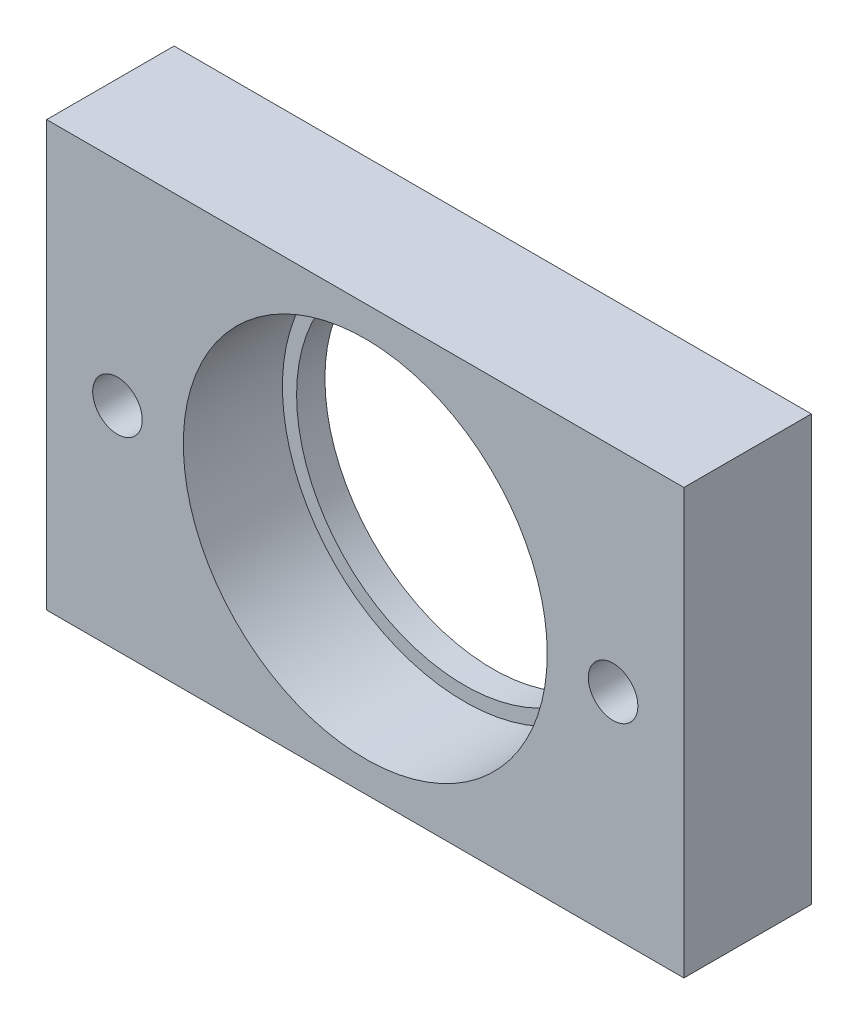
ISO-10303-21;
HEADER;
FILE_DESCRIPTION(('STEP AP214'),'2;1');
FILE_NAME('part.step','',(''),(''),'','','');
FILE_SCHEMA(('AUTOMOTIVE_DESIGN { 1 0 10303 214 1 1 1 1 }'));
ENDSEC;
DATA;
#1=APPLICATION_CONTEXT('core data for automotive mechanical design processes');
#2=APPLICATION_PROTOCOL_DEFINITION('international standard','automotive_design',2000,#1);
#3=PRODUCT_CONTEXT('',#1,'mechanical');
#4=PRODUCT('Part','Part','',(#3));
#5=PRODUCT_RELATED_PRODUCT_CATEGORY('part','',(#4));
#6=PRODUCT_DEFINITION_FORMATION('','',#4);
#7=PRODUCT_DEFINITION_CONTEXT('part definition',#1,'design');
#8=PRODUCT_DEFINITION('design','',#6,#7);
#9=PRODUCT_DEFINITION_SHAPE('','',#8);
#10=(LENGTH_UNIT() NAMED_UNIT(*) SI_UNIT(.MILLI.,.METRE.));
#11=(NAMED_UNIT(*) PLANE_ANGLE_UNIT() SI_UNIT($,.RADIAN.));
#12=(NAMED_UNIT(*) SI_UNIT($,.STERADIAN.) SOLID_ANGLE_UNIT());
#13=UNCERTAINTY_MEASURE_WITH_UNIT(LENGTH_MEASURE(1.E-05),#10,'distance_accuracy_value','');
#14=(GEOMETRIC_REPRESENTATION_CONTEXT(3) GLOBAL_UNCERTAINTY_ASSIGNED_CONTEXT((#13)) GLOBAL_UNIT_ASSIGNED_CONTEXT((#10,
#11,#12)) REPRESENTATION_CONTEXT('',''));
#15=CARTESIAN_POINT('',(0.,0.,0.));
#16=DIRECTION('',(0.,0.,1.));
#17=DIRECTION('',(1.,0.,0.));
#18=AXIS2_PLACEMENT_3D('',#15,#16,#17);
#19=CARTESIAN_POINT('',(0.,0.,9.));
#20=DIRECTION('',(0.,0.,-1.));
#21=DIRECTION('',(-1.,0.,0.));
#22=AXIS2_PLACEMENT_3D('',#19,#20,#21);
#23=CYLINDRICAL_SURFACE('',#22,11.85);
#24=CARTESIAN_POINT('',(0.,0.,0.));
#25=DIRECTION('',(0.,0.,1.));
#26=DIRECTION('',(1.,0.,0.));
#27=AXIS2_PLACEMENT_3D('',#24,#25,#26);
#28=CIRCLE('',#27,11.85);
#29=CARTESIAN_POINT('',(11.85,0.,0.));
#30=VERTEX_POINT('',#29);
#31=EDGE_CURVE('E117',#30,#30,#28,.T.);
#32=ORIENTED_EDGE('',*,*,#31,.F.);
#33=EDGE_LOOP('',(#32));
#34=FACE_BOUND('',#33,.T.);
#35=CARTESIAN_POINT('',(0.,0.,2.));
#36=DIRECTION('',(0.,0.,1.));
#37=DIRECTION('',(1.,0.,0.));
#38=AXIS2_PLACEMENT_3D('',#35,#36,#37);
#39=CIRCLE('',#38,11.85);
#40=CARTESIAN_POINT('',(11.85,0.,2.));
#41=VERTEX_POINT('',#40);
#42=EDGE_CURVE('E42',#41,#41,#39,.T.);
#43=ORIENTED_EDGE('',*,*,#42,.T.);
#44=EDGE_LOOP('',(#43));
#45=FACE_BOUND('',#44,.T.);
#46=ADVANCED_FACE('F38',(#34,#45),#23,.F.);
#47=CARTESIAN_POINT('',(0.,0.,9.));
#48=DIRECTION('',(0.,0.,1.));
#49=DIRECTION('',(1.,0.,0.));
#50=AXIS2_PLACEMENT_3D('',#47,#48,#49);
#51=PLANE('',#50);
#52=CARTESIAN_POINT('',(0.,0.,9.));
#53=DIRECTION('',(0.,0.,1.));
#54=DIRECTION('',(1.,0.,0.));
#55=AXIS2_PLACEMENT_3D('',#52,#53,#54);
#56=CIRCLE('',#55,12.85);
#57=CARTESIAN_POINT('',(12.85,0.,9.));
#58=VERTEX_POINT('',#57);
#59=EDGE_CURVE('E148',#58,#58,#56,.T.);
#60=ORIENTED_EDGE('',*,*,#59,.F.);
#61=EDGE_LOOP('',(#60));
#62=FACE_BOUND('',#61,.T.);
#63=CARTESIAN_POINT('',(-17.5,0.,9.));
#64=DIRECTION('',(0.,0.,1.));
#65=DIRECTION('',(1.,0.,0.));
#66=AXIS2_PLACEMENT_3D('',#63,#64,#65);
#67=CIRCLE('',#66,1.75);
#68=CARTESIAN_POINT('',(-15.75,0.,9.));
#69=VERTEX_POINT('',#68);
#70=EDGE_CURVE('E135',#69,#69,#67,.T.);
#71=ORIENTED_EDGE('',*,*,#70,.F.);
#72=EDGE_LOOP('',(#71));
#73=FACE_BOUND('',#72,.T.);
#74=DIRECTION('',(0.,-1.,0.));
#75=VECTOR('',#74,1.);
#76=CARTESIAN_POINT('',(-22.5,15.,9.));
#77=LINE('',#76,#75);
#78=CARTESIAN_POINT('',(-22.5,15.,9.));
#79=VERTEX_POINT('',#78);
#80=CARTESIAN_POINT('',(-22.5,-15.,9.));
#81=VERTEX_POINT('',#80);
#82=EDGE_CURVE('E95',#79,#81,#77,.T.);
#83=ORIENTED_EDGE('',*,*,#82,.T.);
#84=DIRECTION('',(1.,0.,0.));
#85=VECTOR('',#84,1.);
#86=CARTESIAN_POINT('',(-22.5,-15.,9.));
#87=LINE('',#86,#85);
#88=CARTESIAN_POINT('',(22.5,-15.,9.));
#89=VERTEX_POINT('',#88);
#90=EDGE_CURVE('E88',#81,#89,#87,.T.);
#91=ORIENTED_EDGE('',*,*,#90,.T.);
#92=DIRECTION('',(0.,1.,0.));
#93=VECTOR('',#92,1.);
#94=CARTESIAN_POINT('',(22.5,15.,9.));
#95=LINE('',#94,#93);
#96=CARTESIAN_POINT('',(22.5,15.,9.));
#97=VERTEX_POINT('',#96);
#98=EDGE_CURVE('E93',#89,#97,#95,.T.);
#99=ORIENTED_EDGE('',*,*,#98,.T.);
#100=DIRECTION('',(-1.,0.,0.));
#101=VECTOR('',#100,1.);
#102=CARTESIAN_POINT('',(-22.5,15.,9.));
#103=LINE('',#102,#101);
#104=EDGE_CURVE('E56',#97,#79,#103,.T.);
#105=ORIENTED_EDGE('',*,*,#104,.T.);
#106=EDGE_LOOP('',(#83,#91,#99,#105));
#107=FACE_BOUND('',#106,.T.);
#108=CARTESIAN_POINT('',(17.5,0.,9.));
#109=DIRECTION('',(0.,0.,1.));
#110=DIRECTION('',(1.,0.,0.));
#111=AXIS2_PLACEMENT_3D('',#108,#109,#110);
#112=CIRCLE('',#111,1.75);
#113=CARTESIAN_POINT('',(19.25,0.,9.));
#114=VERTEX_POINT('',#113);
#115=EDGE_CURVE('E139',#114,#114,#112,.T.);
#116=ORIENTED_EDGE('',*,*,#115,.F.);
#117=EDGE_LOOP('',(#116));
#118=FACE_BOUND('',#117,.T.);
#119=ADVANCED_FACE('F90',(#62,#73,#107,#118),#51,.T.);
#120=CARTESIAN_POINT('',(0.,0.,0.));
#121=DIRECTION('',(0.,0.,1.));
#122=DIRECTION('',(1.,0.,0.));
#123=AXIS2_PLACEMENT_3D('',#120,#121,#122);
#124=PLANE('',#123);
#125=DIRECTION('',(0.,-1.,0.));
#126=VECTOR('',#125,1.);
#127=CARTESIAN_POINT('',(-22.5,15.,0.));
#128=LINE('',#127,#126);
#129=CARTESIAN_POINT('',(-22.5,15.,0.));
#130=VERTEX_POINT('',#129);
#131=CARTESIAN_POINT('',(-22.5,-15.,0.));
#132=VERTEX_POINT('',#131);
#133=EDGE_CURVE('E114',#130,#132,#128,.T.);
#134=ORIENTED_EDGE('',*,*,#133,.F.);
#135=DIRECTION('',(-1.,0.,0.));
#136=VECTOR('',#135,1.);
#137=CARTESIAN_POINT('',(-22.5,15.,0.));
#138=LINE('',#137,#136);
#139=CARTESIAN_POINT('',(22.5,15.,0.));
#140=VERTEX_POINT('',#139);
#141=EDGE_CURVE('E81',#140,#130,#138,.T.);
#142=ORIENTED_EDGE('',*,*,#141,.F.);
#143=DIRECTION('',(0.,1.,0.));
#144=VECTOR('',#143,1.);
#145=CARTESIAN_POINT('',(22.5,15.,0.));
#146=LINE('',#145,#144);
#147=CARTESIAN_POINT('',(22.5,-15.,0.));
#148=VERTEX_POINT('',#147);
#149=EDGE_CURVE('E75',#148,#140,#146,.T.);
#150=ORIENTED_EDGE('',*,*,#149,.F.);
#151=DIRECTION('',(1.,0.,0.));
#152=VECTOR('',#151,1.);
#153=CARTESIAN_POINT('',(-22.5,-15.,0.));
#154=LINE('',#153,#152);
#155=EDGE_CURVE('E100',#132,#148,#154,.T.);
#156=ORIENTED_EDGE('',*,*,#155,.F.);
#157=EDGE_LOOP('',(#134,#142,#150,#156));
#158=FACE_BOUND('',#157,.T.);
#159=ORIENTED_EDGE('',*,*,#31,.T.);
#160=EDGE_LOOP('',(#159));
#161=FACE_BOUND('',#160,.T.);
#162=CARTESIAN_POINT('',(-17.5,0.,0.));
#163=DIRECTION('',(0.,0.,1.));
#164=DIRECTION('',(1.,0.,0.));
#165=AXIS2_PLACEMENT_3D('',#162,#163,#164);
#166=CIRCLE('',#165,1.75);
#167=CARTESIAN_POINT('',(-15.75,0.,0.));
#168=VERTEX_POINT('',#167);
#169=EDGE_CURVE('E136',#168,#168,#166,.T.);
#170=ORIENTED_EDGE('',*,*,#169,.T.);
#171=EDGE_LOOP('',(#170));
#172=FACE_BOUND('',#171,.T.);
#173=CARTESIAN_POINT('',(17.5,0.,0.));
#174=DIRECTION('',(0.,0.,1.));
#175=DIRECTION('',(1.,0.,0.));
#176=AXIS2_PLACEMENT_3D('',#173,#174,#175);
#177=CIRCLE('',#176,1.75);
#178=CARTESIAN_POINT('',(19.25,0.,0.));
#179=VERTEX_POINT('',#178);
#180=EDGE_CURVE('E142',#179,#179,#177,.T.);
#181=ORIENTED_EDGE('',*,*,#180,.T.);
#182=EDGE_LOOP('',(#181));
#183=FACE_BOUND('',#182,.T.);
#184=ADVANCED_FACE('F129',(#158,#161,#172,#183),#124,.F.);
#185=CARTESIAN_POINT('',(-22.5,15.,9.));
#186=DIRECTION('',(1.,0.,0.));
#187=DIRECTION('',(0.,1.,0.));
#188=AXIS2_PLACEMENT_3D('',#185,#186,#187);
#189=PLANE('',#188);
#190=ORIENTED_EDGE('',*,*,#133,.T.);
#191=DIRECTION('',(0.,0.,-1.));
#192=VECTOR('',#191,1.);
#193=CARTESIAN_POINT('',(-22.5,-15.,9.));
#194=LINE('',#193,#192);
#195=EDGE_CURVE('E11',#81,#132,#194,.T.);
#196=ORIENTED_EDGE('',*,*,#195,.F.);
#197=ORIENTED_EDGE('',*,*,#82,.F.);
#198=DIRECTION('',(0.,0.,-1.));
#199=VECTOR('',#198,1.);
#200=CARTESIAN_POINT('',(-22.5,15.,9.));
#201=LINE('',#200,#199);
#202=EDGE_CURVE('E110',#79,#130,#201,.T.);
#203=ORIENTED_EDGE('',*,*,#202,.T.);
#204=EDGE_LOOP('',(#190,#196,#197,#203));
#205=FACE_BOUND('',#204,.T.);
#206=ADVANCED_FACE('F40',(#205),#189,.F.);
#207=CARTESIAN_POINT('',(-22.5,-15.,9.));
#208=DIRECTION('',(0.,1.,0.));
#209=DIRECTION('',(-1.,0.,0.));
#210=AXIS2_PLACEMENT_3D('',#207,#208,#209);
#211=PLANE('',#210);
#212=ORIENTED_EDGE('',*,*,#155,.T.);
#213=DIRECTION('',(0.,0.,-1.));
#214=VECTOR('',#213,1.);
#215=CARTESIAN_POINT('',(22.5,-15.,9.));
#216=LINE('',#215,#214);
#217=EDGE_CURVE('E48',#89,#148,#216,.T.);
#218=ORIENTED_EDGE('',*,*,#217,.F.);
#219=ORIENTED_EDGE('',*,*,#90,.F.);
#220=ORIENTED_EDGE('',*,*,#195,.T.);
#221=EDGE_LOOP('',(#212,#218,#219,#220));
#222=FACE_BOUND('',#221,.T.);
#223=ADVANCED_FACE('F99',(#222),#211,.F.);
#224=CARTESIAN_POINT('',(22.5,15.,9.));
#225=DIRECTION('',(-1.,0.,0.));
#226=DIRECTION('',(0.,-1.,0.));
#227=AXIS2_PLACEMENT_3D('',#224,#225,#226);
#228=PLANE('',#227);
#229=ORIENTED_EDGE('',*,*,#149,.T.);
#230=DIRECTION('',(0.,0.,-1.));
#231=VECTOR('',#230,1.);
#232=CARTESIAN_POINT('',(22.5,15.,9.));
#233=LINE('',#232,#231);
#234=EDGE_CURVE('E102',#97,#140,#233,.T.);
#235=ORIENTED_EDGE('',*,*,#234,.F.);
#236=ORIENTED_EDGE('',*,*,#98,.F.);
#237=ORIENTED_EDGE('',*,*,#217,.T.);
#238=EDGE_LOOP('',(#229,#235,#236,#237));
#239=FACE_BOUND('',#238,.T.);
#240=ADVANCED_FACE('F104',(#239),#228,.F.);
#241=CARTESIAN_POINT('',(-22.5,15.,9.));
#242=DIRECTION('',(0.,-1.,0.));
#243=DIRECTION('',(0.,0.,-1.));
#244=AXIS2_PLACEMENT_3D('',#241,#242,#243);
#245=PLANE('',#244);
#246=ORIENTED_EDGE('',*,*,#141,.T.);
#247=ORIENTED_EDGE('',*,*,#202,.F.);
#248=ORIENTED_EDGE('',*,*,#104,.F.);
#249=ORIENTED_EDGE('',*,*,#234,.T.);
#250=EDGE_LOOP('',(#246,#247,#248,#249));
#251=FACE_BOUND('',#250,.T.);
#252=ADVANCED_FACE('F126',(#251),#245,.F.);
#253=CARTESIAN_POINT('',(-17.5,0.,9.));
#254=DIRECTION('',(0.,0.,-1.));
#255=DIRECTION('',(-1.,0.,0.));
#256=AXIS2_PLACEMENT_3D('',#253,#254,#255);
#257=CYLINDRICAL_SURFACE('',#256,1.75);
#258=ORIENTED_EDGE('',*,*,#70,.T.);
#259=EDGE_LOOP('',(#258));
#260=FACE_BOUND('',#259,.T.);
#261=ORIENTED_EDGE('',*,*,#169,.F.);
#262=EDGE_LOOP('',(#261));
#263=FACE_BOUND('',#262,.T.);
#264=ADVANCED_FACE('F181',(#260,#263),#257,.F.);
#265=CARTESIAN_POINT('',(17.5,0.,9.));
#266=DIRECTION('',(0.,0.,-1.));
#267=DIRECTION('',(-1.,0.,0.));
#268=AXIS2_PLACEMENT_3D('',#265,#266,#267);
#269=CYLINDRICAL_SURFACE('',#268,1.75);
#270=ORIENTED_EDGE('',*,*,#115,.T.);
#271=EDGE_LOOP('',(#270));
#272=FACE_BOUND('',#271,.T.);
#273=ORIENTED_EDGE('',*,*,#180,.F.);
#274=EDGE_LOOP('',(#273));
#275=FACE_BOUND('',#274,.T.);
#276=ADVANCED_FACE('F168',(#272,#275),#269,.F.);
#277=CARTESIAN_POINT('',(0.,0.,2.));
#278=DIRECTION('',(0.,0.,1.));
#279=DIRECTION('',(1.,0.,0.));
#280=AXIS2_PLACEMENT_3D('',#277,#278,#279);
#281=CYLINDRICAL_SURFACE('',#280,12.85);
#282=CARTESIAN_POINT('',(0.,0.,2.));
#283=DIRECTION('',(0.,0.,1.));
#284=DIRECTION('',(1.,0.,0.));
#285=AXIS2_PLACEMENT_3D('',#282,#283,#284);
#286=CIRCLE('',#285,12.85);
#287=CARTESIAN_POINT('',(12.85,0.,2.));
#288=VERTEX_POINT('',#287);
#289=EDGE_CURVE('E152',#288,#288,#286,.T.);
#290=ORIENTED_EDGE('',*,*,#289,.F.);
#291=EDGE_LOOP('',(#290));
#292=FACE_BOUND('',#291,.T.);
#293=ORIENTED_EDGE('',*,*,#59,.T.);
#294=EDGE_LOOP('',(#293));
#295=FACE_BOUND('',#294,.T.);
#296=ADVANCED_FACE('F163',(#292,#295),#281,.F.);
#297=CARTESIAN_POINT('',(0.,0.,2.));
#298=DIRECTION('',(0.,0.,1.));
#299=DIRECTION('',(1.,0.,0.));
#300=AXIS2_PLACEMENT_3D('',#297,#298,#299);
#301=PLANE('',#300);
#302=ORIENTED_EDGE('',*,*,#42,.F.);
#303=EDGE_LOOP('',(#302));
#304=FACE_BOUND('',#303,.T.);
#305=ORIENTED_EDGE('',*,*,#289,.T.);
#306=EDGE_LOOP('',(#305));
#307=FACE_BOUND('',#306,.T.);
#308=ADVANCED_FACE('F161',(#304,#307),#301,.T.);
#309=CLOSED_SHELL('',(#46,#119,#184,#206,#223,#240,#252,#264,#276,#296,#308));
#310=MANIFOLD_SOLID_BREP('B2',#309);
#311=ADVANCED_BREP_SHAPE_REPRESENTATION('',(#18,#310),#14);
#312=SHAPE_DEFINITION_REPRESENTATION(#9,#311);
ENDSEC;
END-ISO-10303-21;
